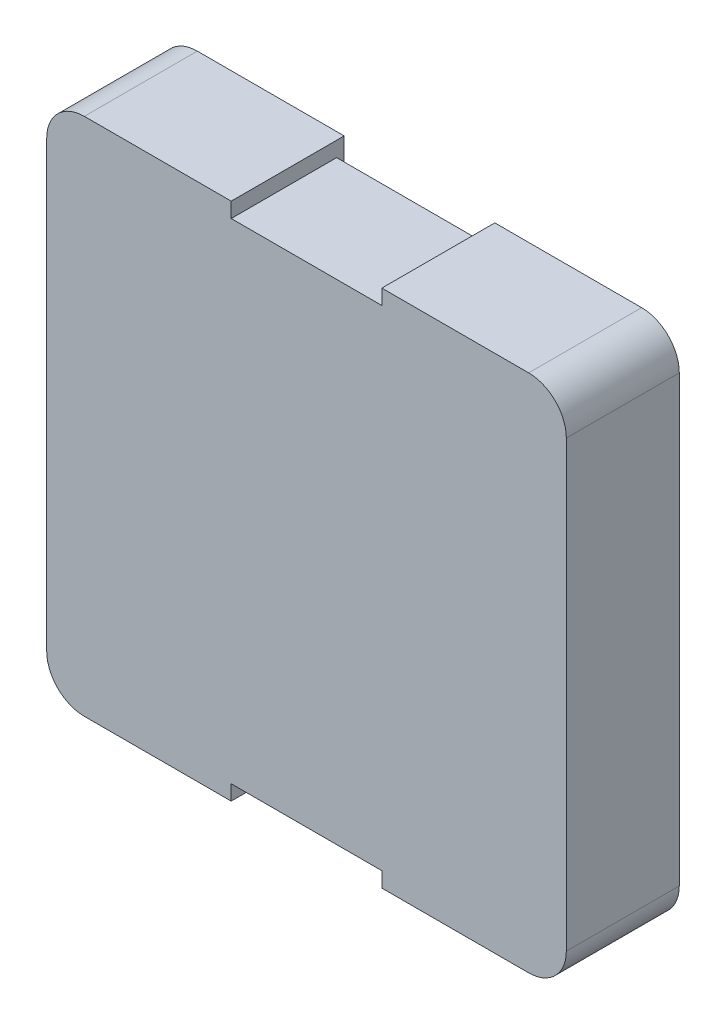
ISO-10303-21;
HEADER;
FILE_DESCRIPTION(('STEP AP214'),'2;1');
FILE_NAME('part.step','',(''),(''),'','','');
FILE_SCHEMA(('AUTOMOTIVE_DESIGN { 1 0 10303 214 1 1 1 1 }'));
ENDSEC;
DATA;
#1=APPLICATION_CONTEXT('core data for automotive mechanical design processes');
#2=APPLICATION_PROTOCOL_DEFINITION('international standard','automotive_design',2000,#1);
#3=PRODUCT_CONTEXT('',#1,'mechanical');
#4=PRODUCT('Part','Part','',(#3));
#5=PRODUCT_RELATED_PRODUCT_CATEGORY('part','',(#4));
#6=PRODUCT_DEFINITION_FORMATION('','',#4);
#7=PRODUCT_DEFINITION_CONTEXT('part definition',#1,'design');
#8=PRODUCT_DEFINITION('design','',#6,#7);
#9=PRODUCT_DEFINITION_SHAPE('','',#8);
#10=(LENGTH_UNIT() NAMED_UNIT(*) SI_UNIT(.MILLI.,.METRE.));
#11=(NAMED_UNIT(*) PLANE_ANGLE_UNIT() SI_UNIT($,.RADIAN.));
#12=(NAMED_UNIT(*) SI_UNIT($,.STERADIAN.) SOLID_ANGLE_UNIT());
#13=UNCERTAINTY_MEASURE_WITH_UNIT(LENGTH_MEASURE(1.E-05),#10,'distance_accuracy_value','');
#14=(GEOMETRIC_REPRESENTATION_CONTEXT(3) GLOBAL_UNCERTAINTY_ASSIGNED_CONTEXT((#13)) GLOBAL_UNIT_ASSIGNED_CONTEXT((#10,
#11,#12)) REPRESENTATION_CONTEXT('',''));
#15=CARTESIAN_POINT('',(0.,0.,0.));
#16=DIRECTION('',(0.,0.,1.));
#17=DIRECTION('',(1.,0.,0.));
#18=AXIS2_PLACEMENT_3D('',#15,#16,#17);
#19=CARTESIAN_POINT('',(-1.,1.5,1.5));
#20=DIRECTION('',(1.,0.,0.));
#21=DIRECTION('',(0.,0.,-1.));
#22=AXIS2_PLACEMENT_3D('',#19,#20,#21);
#23=PLANE('',#22);
#24=DIRECTION('',(0.,0.,-1.));
#25=VECTOR('',#24,1.);
#26=CARTESIAN_POINT('',(-1.,3.25,1.5));
#27=LINE('',#26,#25);
#28=CARTESIAN_POINT('',(-1.,3.25,1.5));
#29=VERTEX_POINT('',#28);
#30=CARTESIAN_POINT('',(-1.,3.25,0.1));
#31=VERTEX_POINT('',#30);
#32=EDGE_CURVE('E171',#29,#31,#27,.T.);
#33=ORIENTED_EDGE('',*,*,#32,.T.);
#34=DIRECTION('',(0.,1.,0.));
#35=VECTOR('',#34,1.);
#36=CARTESIAN_POINT('',(-1.,1.5,0.1));
#37=LINE('',#36,#35);
#38=CARTESIAN_POINT('',(-1.,1.5,0.1));
#39=VERTEX_POINT('',#38);
#40=EDGE_CURVE('E173',#39,#31,#37,.T.);
#41=ORIENTED_EDGE('',*,*,#40,.F.);
#42=DIRECTION('',(0.,0.,1.));
#43=VECTOR('',#42,1.);
#44=CARTESIAN_POINT('',(-1.,1.5,0.));
#45=LINE('',#44,#43);
#46=CARTESIAN_POINT('',(-1.,1.5,0.));
#47=VERTEX_POINT('',#46);
#48=EDGE_CURVE('E180',#47,#39,#45,.T.);
#49=ORIENTED_EDGE('',*,*,#48,.F.);
#50=DIRECTION('',(0.,1.,0.));
#51=VECTOR('',#50,1.);
#52=CARTESIAN_POINT('',(-1.,-3.45,0.));
#53=LINE('',#52,#51);
#54=CARTESIAN_POINT('',(-1.,3.45,0.));
#55=VERTEX_POINT('',#54);
#56=EDGE_CURVE('E228',#55,#47,#53,.F.);
#57=ORIENTED_EDGE('',*,*,#56,.F.);
#58=DIRECTION('',(0.,0.,-1.));
#59=VECTOR('',#58,1.);
#60=CARTESIAN_POINT('',(-1.,3.45,1.5));
#61=LINE('',#60,#59);
#62=CARTESIAN_POINT('',(-1.,3.45,1.5));
#63=VERTEX_POINT('',#62);
#64=EDGE_CURVE('E100',#55,#63,#61,.F.);
#65=ORIENTED_EDGE('',*,*,#64,.T.);
#66=DIRECTION('',(0.,1.,0.));
#67=VECTOR('',#66,1.);
#68=CARTESIAN_POINT('',(-1.,1.5,1.5));
#69=LINE('',#68,#67);
#70=EDGE_CURVE('E175',#63,#29,#69,.F.);
#71=ORIENTED_EDGE('',*,*,#70,.T.);
#72=EDGE_LOOP('',(#33,#41,#49,#57,#65,#71));
#73=FACE_BOUND('',#72,.T.);
#74=ADVANCED_FACE('F17',(#73),#23,.T.);
#75=CARTESIAN_POINT('',(1.,1.5,0.));
#76=DIRECTION('',(0.,1.,0.));
#77=DIRECTION('',(0.,0.,1.));
#78=AXIS2_PLACEMENT_3D('',#75,#76,#77);
#79=PLANE('',#78);
#80=DIRECTION('',(-1.,0.,0.));
#81=VECTOR('',#80,1.);
#82=CARTESIAN_POINT('',(3.45,1.5,0.));
#83=LINE('',#82,#81);
#84=CARTESIAN_POINT('',(1.,1.5,0.));
#85=VERTEX_POINT('',#84);
#86=EDGE_CURVE('E347',#47,#85,#83,.F.);
#87=ORIENTED_EDGE('',*,*,#86,.F.);
#88=ORIENTED_EDGE('',*,*,#48,.T.);
#89=DIRECTION('',(-1.,0.,0.));
#90=VECTOR('',#89,1.);
#91=CARTESIAN_POINT('',(1.,1.5,0.1));
#92=LINE('',#91,#90);
#93=CARTESIAN_POINT('',(1.,1.5,0.1));
#94=VERTEX_POINT('',#93);
#95=EDGE_CURVE('E187',#94,#39,#92,.T.);
#96=ORIENTED_EDGE('',*,*,#95,.F.);
#97=DIRECTION('',(0.,0.,1.));
#98=VECTOR('',#97,1.);
#99=CARTESIAN_POINT('',(1.,1.5,0.));
#100=LINE('',#99,#98);
#101=EDGE_CURVE('E338',#85,#94,#100,.T.);
#102=ORIENTED_EDGE('',*,*,#101,.F.);
#103=EDGE_LOOP('',(#87,#88,#96,#102));
#104=FACE_BOUND('',#103,.T.);
#105=ADVANCED_FACE('F451',(#104),#79,.T.);
#106=CARTESIAN_POINT('',(1.,3.45,0.));
#107=DIRECTION('',(-1.,0.,0.));
#108=DIRECTION('',(0.,0.,1.));
#109=AXIS2_PLACEMENT_3D('',#106,#107,#108);
#110=PLANE('',#109);
#111=ORIENTED_EDGE('',*,*,#101,.T.);
#112=DIRECTION('',(0.,1.,0.));
#113=VECTOR('',#112,1.);
#114=CARTESIAN_POINT('',(1.,1.5,0.1));
#115=LINE('',#114,#113);
#116=CARTESIAN_POINT('',(1.,3.25,0.1));
#117=VERTEX_POINT('',#116);
#118=EDGE_CURVE('E188',#117,#94,#115,.F.);
#119=ORIENTED_EDGE('',*,*,#118,.F.);
#120=DIRECTION('',(0.,0.,1.));
#121=VECTOR('',#120,1.);
#122=CARTESIAN_POINT('',(1.,3.25,0.));
#123=LINE('',#122,#121);
#124=CARTESIAN_POINT('',(1.,3.25,1.5));
#125=VERTEX_POINT('',#124);
#126=EDGE_CURVE('E192',#117,#125,#123,.T.);
#127=ORIENTED_EDGE('',*,*,#126,.T.);
#128=DIRECTION('',(0.,1.,0.));
#129=VECTOR('',#128,1.);
#130=CARTESIAN_POINT('',(1.,3.45,1.5));
#131=LINE('',#130,#129);
#132=CARTESIAN_POINT('',(1.,3.45,1.5));
#133=VERTEX_POINT('',#132);
#134=EDGE_CURVE('E281',#125,#133,#131,.T.);
#135=ORIENTED_EDGE('',*,*,#134,.T.);
#136=DIRECTION('',(0.,0.,1.));
#137=VECTOR('',#136,1.);
#138=CARTESIAN_POINT('',(1.,3.45,0.));
#139=LINE('',#138,#137);
#140=CARTESIAN_POINT('',(1.,3.45,0.));
#141=VERTEX_POINT('',#140);
#142=EDGE_CURVE('E284',#133,#141,#139,.F.);
#143=ORIENTED_EDGE('',*,*,#142,.T.);
#144=DIRECTION('',(0.,1.,0.));
#145=VECTOR('',#144,1.);
#146=CARTESIAN_POINT('',(1.,-3.45,0.));
#147=LINE('',#146,#145);
#148=EDGE_CURVE('E226',#85,#141,#147,.T.);
#149=ORIENTED_EDGE('',*,*,#148,.F.);
#150=EDGE_LOOP('',(#111,#119,#127,#135,#143,#149));
#151=FACE_BOUND('',#150,.T.);
#152=ADVANCED_FACE('F449',(#151),#110,.T.);
#153=CARTESIAN_POINT('',(1.,-1.5,0.));
#154=DIRECTION('',(-1.,0.,0.));
#155=DIRECTION('',(0.,0.,1.));
#156=AXIS2_PLACEMENT_3D('',#153,#154,#155);
#157=PLANE('',#156);
#158=DIRECTION('',(0.,1.,0.));
#159=VECTOR('',#158,1.);
#160=CARTESIAN_POINT('',(1.,-1.5,1.5));
#161=LINE('',#160,#159);
#162=CARTESIAN_POINT('',(1.,-3.45,1.5));
#163=VERTEX_POINT('',#162);
#164=CARTESIAN_POINT('',(1.,-3.25,1.5));
#165=VERTEX_POINT('',#164);
#166=EDGE_CURVE('E265',#163,#165,#161,.T.);
#167=ORIENTED_EDGE('',*,*,#166,.T.);
#168=DIRECTION('',(0.,0.,1.));
#169=VECTOR('',#168,1.);
#170=CARTESIAN_POINT('',(1.,-3.25,0.));
#171=LINE('',#170,#169);
#172=CARTESIAN_POINT('',(1.,-3.25,0.1));
#173=VERTEX_POINT('',#172);
#174=EDGE_CURVE('E268',#165,#173,#171,.F.);
#175=ORIENTED_EDGE('',*,*,#174,.T.);
#176=DIRECTION('',(0.,1.,0.));
#177=VECTOR('',#176,1.);
#178=CARTESIAN_POINT('',(1.,-3.25,0.1));
#179=LINE('',#178,#177);
#180=CARTESIAN_POINT('',(1.,-1.5,0.1));
#181=VERTEX_POINT('',#180);
#182=EDGE_CURVE('E237',#181,#173,#179,.F.);
#183=ORIENTED_EDGE('',*,*,#182,.F.);
#184=DIRECTION('',(0.,0.,-1.));
#185=VECTOR('',#184,1.);
#186=CARTESIAN_POINT('',(1.,-1.5,0.));
#187=LINE('',#186,#185);
#188=CARTESIAN_POINT('',(1.,-1.5,0.));
#189=VERTEX_POINT('',#188);
#190=EDGE_CURVE('E273',#189,#181,#187,.F.);
#191=ORIENTED_EDGE('',*,*,#190,.F.);
#192=DIRECTION('',(0.,1.,0.));
#193=VECTOR('',#192,1.);
#194=CARTESIAN_POINT('',(1.,-3.45,0.));
#195=LINE('',#194,#193);
#196=CARTESIAN_POINT('',(1.,-3.45,0.));
#197=VERTEX_POINT('',#196);
#198=EDGE_CURVE('E223',#197,#189,#195,.T.);
#199=ORIENTED_EDGE('',*,*,#198,.F.);
#200=DIRECTION('',(0.,0.,1.));
#201=VECTOR('',#200,1.);
#202=CARTESIAN_POINT('',(1.,-3.45,0.));
#203=LINE('',#202,#201);
#204=EDGE_CURVE('E269',#197,#163,#203,.T.);
#205=ORIENTED_EDGE('',*,*,#204,.T.);
#206=EDGE_LOOP('',(#167,#175,#183,#191,#199,#205));
#207=FACE_BOUND('',#206,.T.);
#208=ADVANCED_FACE('F434',(#207),#157,.T.);
#209=CARTESIAN_POINT('',(-1.,-1.5,0.));
#210=DIRECTION('',(0.,-1.,0.));
#211=DIRECTION('',(0.,0.,-1.));
#212=AXIS2_PLACEMENT_3D('',#209,#210,#211);
#213=PLANE('',#212);
#214=DIRECTION('',(-1.,0.,0.));
#215=VECTOR('',#214,1.);
#216=CARTESIAN_POINT('',(3.45,-1.5,0.));
#217=LINE('',#216,#215);
#218=CARTESIAN_POINT('',(-1.,-1.5,0.));
#219=VERTEX_POINT('',#218);
#220=EDGE_CURVE('E329',#189,#219,#217,.T.);
#221=ORIENTED_EDGE('',*,*,#220,.F.);
#222=ORIENTED_EDGE('',*,*,#190,.T.);
#223=DIRECTION('',(-1.,0.,0.));
#224=VECTOR('',#223,1.);
#225=CARTESIAN_POINT('',(1.,-1.5,0.1));
#226=LINE('',#225,#224);
#227=CARTESIAN_POINT('',(-1.,-1.5,0.1));
#228=VERTEX_POINT('',#227);
#229=EDGE_CURVE('E244',#228,#181,#226,.F.);
#230=ORIENTED_EDGE('',*,*,#229,.F.);
#231=DIRECTION('',(0.,0.,-1.));
#232=VECTOR('',#231,1.);
#233=CARTESIAN_POINT('',(-1.,-1.5,0.));
#234=LINE('',#233,#232);
#235=EDGE_CURVE('E317',#219,#228,#234,.F.);
#236=ORIENTED_EDGE('',*,*,#235,.F.);
#237=EDGE_LOOP('',(#221,#222,#230,#236));
#238=FACE_BOUND('',#237,.T.);
#239=ADVANCED_FACE('F437',(#238),#213,.T.);
#240=CARTESIAN_POINT('',(-1.,-3.45,0.));
#241=DIRECTION('',(1.,0.,0.));
#242=DIRECTION('',(0.,0.,-1.));
#243=AXIS2_PLACEMENT_3D('',#240,#241,#242);
#244=PLANE('',#243);
#245=DIRECTION('',(0.,1.,0.));
#246=VECTOR('',#245,1.);
#247=CARTESIAN_POINT('',(-1.,-3.45,1.5));
#248=LINE('',#247,#246);
#249=CARTESIAN_POINT('',(-1.,-3.25,1.5));
#250=VERTEX_POINT('',#249);
#251=CARTESIAN_POINT('',(-1.,-3.45,1.5));
#252=VERTEX_POINT('',#251);
#253=EDGE_CURVE('E304',#250,#252,#248,.F.);
#254=ORIENTED_EDGE('',*,*,#253,.T.);
#255=DIRECTION('',(0.,0.,-1.));
#256=VECTOR('',#255,1.);
#257=CARTESIAN_POINT('',(-1.,-3.45,0.));
#258=LINE('',#257,#256);
#259=CARTESIAN_POINT('',(-1.,-3.45,0.));
#260=VERTEX_POINT('',#259);
#261=EDGE_CURVE('E260',#252,#260,#258,.T.);
#262=ORIENTED_EDGE('',*,*,#261,.T.);
#263=DIRECTION('',(0.,1.,0.));
#264=VECTOR('',#263,1.);
#265=CARTESIAN_POINT('',(-1.,-3.45,0.));
#266=LINE('',#265,#264);
#267=EDGE_CURVE('E220',#219,#260,#266,.F.);
#268=ORIENTED_EDGE('',*,*,#267,.F.);
#269=ORIENTED_EDGE('',*,*,#235,.T.);
#270=DIRECTION('',(0.,1.,0.));
#271=VECTOR('',#270,1.);
#272=CARTESIAN_POINT('',(-1.,-3.25,0.1));
#273=LINE('',#272,#271);
#274=CARTESIAN_POINT('',(-1.,-3.25,0.1));
#275=VERTEX_POINT('',#274);
#276=EDGE_CURVE('E235',#275,#228,#273,.T.);
#277=ORIENTED_EDGE('',*,*,#276,.F.);
#278=DIRECTION('',(0.,0.,-1.));
#279=VECTOR('',#278,1.);
#280=CARTESIAN_POINT('',(-1.,-3.25,0.));
#281=LINE('',#280,#279);
#282=EDGE_CURVE('E307',#275,#250,#281,.F.);
#283=ORIENTED_EDGE('',*,*,#282,.T.);
#284=EDGE_LOOP('',(#254,#262,#268,#269,#277,#283));
#285=FACE_BOUND('',#284,.T.);
#286=ADVANCED_FACE('F383',(#285),#244,.T.);
#287=CARTESIAN_POINT('',(1.,-3.25,0.1));
#288=DIRECTION('',(0.,0.,-1.));
#289=DIRECTION('',(-1.,0.,0.));
#290=AXIS2_PLACEMENT_3D('',#287,#288,#289);
#291=PLANE('',#290);
#292=DIRECTION('',(1.,0.,0.));
#293=VECTOR('',#292,1.);
#294=CARTESIAN_POINT('',(-1.,-3.25,0.1));
#295=LINE('',#294,#293);
#296=EDGE_CURVE('E252',#275,#173,#295,.T.);
#297=ORIENTED_EDGE('',*,*,#296,.F.);
#298=ORIENTED_EDGE('',*,*,#276,.T.);
#299=ORIENTED_EDGE('',*,*,#229,.T.);
#300=ORIENTED_EDGE('',*,*,#182,.T.);
#301=EDGE_LOOP('',(#297,#298,#299,#300));
#302=FACE_BOUND('',#301,.T.);
#303=ADVANCED_FACE('F435',(#302),#291,.T.);
#304=CARTESIAN_POINT('',(2.95,-2.95,1.65));
#305=DIRECTION('',(0.,0.,-1.));
#306=DIRECTION('',(-1.,0.,0.));
#307=AXIS2_PLACEMENT_3D('',#304,#305,#306);
#308=CYLINDRICAL_SURFACE('',#307,0.5);
#309=CARTESIAN_POINT('',(2.95,-2.95,0.));
#310=DIRECTION('',(0.,0.,-1.));
#311=DIRECTION('',(-1.,0.,0.));
#312=AXIS2_PLACEMENT_3D('',#309,#310,#311);
#313=CIRCLE('',#312,0.5);
#314=CARTESIAN_POINT('',(3.45,-2.95,0.));
#315=VERTEX_POINT('',#314);
#316=CARTESIAN_POINT('',(2.95,-3.45,0.));
#317=VERTEX_POINT('',#316);
#318=EDGE_CURVE('E221',#315,#317,#313,.T.);
#319=ORIENTED_EDGE('',*,*,#318,.F.);
#320=DIRECTION('',(0.,0.,-1.));
#321=VECTOR('',#320,1.);
#322=CARTESIAN_POINT('',(3.45,-2.95,1.5));
#323=LINE('',#322,#321);
#324=CARTESIAN_POINT('',(3.45,-2.95,1.5));
#325=VERTEX_POINT('',#324);
#326=EDGE_CURVE('E366',#325,#315,#323,.T.);
#327=ORIENTED_EDGE('',*,*,#326,.F.);
#328=CARTESIAN_POINT('',(2.95,-2.95,1.5));
#329=DIRECTION('',(0.,0.,-1.));
#330=DIRECTION('',(-1.,0.,0.));
#331=AXIS2_PLACEMENT_3D('',#328,#329,#330);
#332=CIRCLE('',#331,0.5);
#333=CARTESIAN_POINT('',(2.95,-3.45,1.5));
#334=VERTEX_POINT('',#333);
#335=EDGE_CURVE('E20',#325,#334,#332,.T.);
#336=ORIENTED_EDGE('',*,*,#335,.T.);
#337=DIRECTION('',(0.,0.,-1.));
#338=VECTOR('',#337,1.);
#339=CARTESIAN_POINT('',(2.95,-3.45,1.5));
#340=LINE('',#339,#338);
#341=EDGE_CURVE('E369',#317,#334,#340,.F.);
#342=ORIENTED_EDGE('',*,*,#341,.F.);
#343=EDGE_LOOP('',(#319,#327,#336,#342));
#344=FACE_BOUND('',#343,.T.);
#345=ADVANCED_FACE('F443',(#344),#308,.T.);
#346=CARTESIAN_POINT('',(2.95,2.95,1.65));
#347=DIRECTION('',(0.,0.,-1.));
#348=DIRECTION('',(-1.,0.,0.));
#349=AXIS2_PLACEMENT_3D('',#346,#347,#348);
#350=CYLINDRICAL_SURFACE('',#349,0.5);
#351=CARTESIAN_POINT('',(2.95,2.95,0.));
#352=DIRECTION('',(0.,0.,-1.));
#353=DIRECTION('',(-1.,0.,0.));
#354=AXIS2_PLACEMENT_3D('',#351,#352,#353);
#355=CIRCLE('',#354,0.5);
#356=CARTESIAN_POINT('',(2.95,3.45,0.));
#357=VERTEX_POINT('',#356);
#358=CARTESIAN_POINT('',(3.45,2.95,0.));
#359=VERTEX_POINT('',#358);
#360=EDGE_CURVE('E224',#357,#359,#355,.T.);
#361=ORIENTED_EDGE('',*,*,#360,.F.);
#362=DIRECTION('',(0.,0.,1.));
#363=VECTOR('',#362,1.);
#364=CARTESIAN_POINT('',(2.95,3.45,0.));
#365=LINE('',#364,#363);
#366=CARTESIAN_POINT('',(2.95,3.45,1.5));
#367=VERTEX_POINT('',#366);
#368=EDGE_CURVE('E200',#367,#357,#365,.F.);
#369=ORIENTED_EDGE('',*,*,#368,.F.);
#370=CARTESIAN_POINT('',(2.95,2.95,1.5));
#371=DIRECTION('',(0.,0.,-1.));
#372=DIRECTION('',(-1.,0.,0.));
#373=AXIS2_PLACEMENT_3D('',#370,#371,#372);
#374=CIRCLE('',#373,0.5);
#375=CARTESIAN_POINT('',(3.45,2.95,1.5));
#376=VERTEX_POINT('',#375);
#377=EDGE_CURVE('E229',#367,#376,#374,.T.);
#378=ORIENTED_EDGE('',*,*,#377,.T.);
#379=DIRECTION('',(0.,0.,-1.));
#380=VECTOR('',#379,1.);
#381=CARTESIAN_POINT('',(3.45,2.95,1.5));
#382=LINE('',#381,#380);
#383=EDGE_CURVE('E365',#359,#376,#382,.F.);
#384=ORIENTED_EDGE('',*,*,#383,.F.);
#385=EDGE_LOOP('',(#361,#369,#378,#384));
#386=FACE_BOUND('',#385,.T.);
#387=ADVANCED_FACE('F445',(#386),#350,.T.);
#388=CARTESIAN_POINT('',(1.,1.5,0.1));
#389=DIRECTION('',(0.,0.,-1.));
#390=DIRECTION('',(-1.,0.,0.));
#391=AXIS2_PLACEMENT_3D('',#388,#389,#390);
#392=PLANE('',#391);
#393=DIRECTION('',(1.,0.,0.));
#394=VECTOR('',#393,1.);
#395=CARTESIAN_POINT('',(-1.,3.25,0.1));
#396=LINE('',#395,#394);
#397=EDGE_CURVE('E186',#117,#31,#396,.F.);
#398=ORIENTED_EDGE('',*,*,#397,.F.);
#399=ORIENTED_EDGE('',*,*,#118,.T.);
#400=ORIENTED_EDGE('',*,*,#95,.T.);
#401=ORIENTED_EDGE('',*,*,#40,.T.);
#402=EDGE_LOOP('',(#398,#399,#400,#401));
#403=FACE_BOUND('',#402,.T.);
#404=ADVANCED_FACE('F184',(#403),#392,.T.);
#405=CARTESIAN_POINT('',(-2.95,2.95,1.65));
#406=DIRECTION('',(0.,0.,-1.));
#407=DIRECTION('',(-1.,0.,0.));
#408=AXIS2_PLACEMENT_3D('',#405,#406,#407);
#409=CYLINDRICAL_SURFACE('',#408,0.5);
#410=CARTESIAN_POINT('',(-2.95,2.95,0.));
#411=DIRECTION('',(0.,0.,-1.));
#412=DIRECTION('',(-1.,0.,0.));
#413=AXIS2_PLACEMENT_3D('',#410,#411,#412);
#414=CIRCLE('',#413,0.5);
#415=CARTESIAN_POINT('',(-3.45,2.95,0.));
#416=VERTEX_POINT('',#415);
#417=CARTESIAN_POINT('',(-2.95,3.45,0.));
#418=VERTEX_POINT('',#417);
#419=EDGE_CURVE('E87',#416,#418,#414,.T.);
#420=ORIENTED_EDGE('',*,*,#419,.F.);
#421=DIRECTION('',(0.,0.,1.));
#422=VECTOR('',#421,1.);
#423=CARTESIAN_POINT('',(-3.45,2.95,0.));
#424=LINE('',#423,#422);
#425=CARTESIAN_POINT('',(-3.45,2.95,1.5));
#426=VERTEX_POINT('',#425);
#427=EDGE_CURVE('E399',#426,#416,#424,.F.);
#428=ORIENTED_EDGE('',*,*,#427,.F.);
#429=CARTESIAN_POINT('',(-2.95,2.95,1.5));
#430=DIRECTION('',(0.,0.,-1.));
#431=DIRECTION('',(-1.,0.,0.));
#432=AXIS2_PLACEMENT_3D('',#429,#430,#431);
#433=CIRCLE('',#432,0.5);
#434=CARTESIAN_POINT('',(-2.95,3.45,1.5));
#435=VERTEX_POINT('',#434);
#436=EDGE_CURVE('E34',#426,#435,#433,.T.);
#437=ORIENTED_EDGE('',*,*,#436,.T.);
#438=DIRECTION('',(0.,0.,1.));
#439=VECTOR('',#438,1.);
#440=CARTESIAN_POINT('',(-2.95,3.45,0.));
#441=LINE('',#440,#439);
#442=EDGE_CURVE('E197',#418,#435,#441,.T.);
#443=ORIENTED_EDGE('',*,*,#442,.F.);
#444=EDGE_LOOP('',(#420,#428,#437,#443));
#445=FACE_BOUND('',#444,.T.);
#446=ADVANCED_FACE('F487',(#445),#409,.T.);
#447=CARTESIAN_POINT('',(3.45,-3.45,0.));
#448=DIRECTION('',(0.,0.,-1.));
#449=DIRECTION('',(-1.,0.,0.));
#450=AXIS2_PLACEMENT_3D('',#447,#448,#449);
#451=PLANE('',#450);
#452=CARTESIAN_POINT('',(-2.95,-2.95,0.));
#453=DIRECTION('',(0.,0.,-1.));
#454=DIRECTION('',(-1.,0.,0.));
#455=AXIS2_PLACEMENT_3D('',#452,#453,#454);
#456=CIRCLE('',#455,0.5);
#457=CARTESIAN_POINT('',(-3.45,-2.95,0.));
#458=VERTEX_POINT('',#457);
#459=CARTESIAN_POINT('',(-2.95,-3.45,0.));
#460=VERTEX_POINT('',#459);
#461=EDGE_CURVE('E215',#458,#460,#456,.F.);
#462=ORIENTED_EDGE('',*,*,#461,.F.);
#463=DIRECTION('',(0.,1.,0.));
#464=VECTOR('',#463,1.);
#465=CARTESIAN_POINT('',(-3.45,-2.95,0.));
#466=LINE('',#465,#464);
#467=EDGE_CURVE('E396',#416,#458,#466,.F.);
#468=ORIENTED_EDGE('',*,*,#467,.F.);
#469=ORIENTED_EDGE('',*,*,#419,.T.);
#470=DIRECTION('',(1.,0.,0.));
#471=VECTOR('',#470,1.);
#472=CARTESIAN_POINT('',(-1.,3.45,0.));
#473=LINE('',#472,#471);
#474=EDGE_CURVE('E194',#55,#418,#473,.F.);
#475=ORIENTED_EDGE('',*,*,#474,.F.);
#476=ORIENTED_EDGE('',*,*,#56,.T.);
#477=ORIENTED_EDGE('',*,*,#86,.T.);
#478=ORIENTED_EDGE('',*,*,#148,.T.);
#479=DIRECTION('',(1.,0.,0.));
#480=VECTOR('',#479,1.);
#481=CARTESIAN_POINT('',(2.95,3.45,0.));
#482=LINE('',#481,#480);
#483=EDGE_CURVE('E195',#357,#141,#482,.F.);
#484=ORIENTED_EDGE('',*,*,#483,.F.);
#485=ORIENTED_EDGE('',*,*,#360,.T.);
#486=DIRECTION('',(0.,1.,0.));
#487=VECTOR('',#486,1.);
#488=CARTESIAN_POINT('',(3.45,-2.95,0.));
#489=LINE('',#488,#487);
#490=EDGE_CURVE('E362',#315,#359,#489,.T.);
#491=ORIENTED_EDGE('',*,*,#490,.F.);
#492=ORIENTED_EDGE('',*,*,#318,.T.);
#493=DIRECTION('',(1.,0.,0.));
#494=VECTOR('',#493,1.);
#495=CARTESIAN_POINT('',(1.,-3.45,0.));
#496=LINE('',#495,#494);
#497=EDGE_CURVE('E255',#197,#317,#496,.T.);
#498=ORIENTED_EDGE('',*,*,#497,.F.);
#499=ORIENTED_EDGE('',*,*,#198,.T.);
#500=ORIENTED_EDGE('',*,*,#220,.T.);
#501=ORIENTED_EDGE('',*,*,#267,.T.);
#502=DIRECTION('',(1.,0.,0.));
#503=VECTOR('',#502,1.);
#504=CARTESIAN_POINT('',(-2.95,-3.45,0.));
#505=LINE('',#504,#503);
#506=EDGE_CURVE('E256',#460,#260,#505,.T.);
#507=ORIENTED_EDGE('',*,*,#506,.F.);
#508=EDGE_LOOP('',(#462,#468,#469,#475,#476,#477,#478,#484,#485,#491,#492,#498,#499,#500,#501,#507));
#509=FACE_BOUND('',#508,.T.);
#510=ADVANCED_FACE('F387',(#509),#451,.T.);
#511=CARTESIAN_POINT('',(-2.95,-2.95,1.65));
#512=DIRECTION('',(0.,0.,-1.));
#513=DIRECTION('',(-1.,0.,0.));
#514=AXIS2_PLACEMENT_3D('',#511,#512,#513);
#515=CYLINDRICAL_SURFACE('',#514,0.5);
#516=ORIENTED_EDGE('',*,*,#461,.T.);
#517=DIRECTION('',(0.,0.,-1.));
#518=VECTOR('',#517,1.);
#519=CARTESIAN_POINT('',(-2.95,-3.45,1.5));
#520=LINE('',#519,#518);
#521=CARTESIAN_POINT('',(-2.95,-3.45,1.5));
#522=VERTEX_POINT('',#521);
#523=EDGE_CURVE('E218',#522,#460,#520,.T.);
#524=ORIENTED_EDGE('',*,*,#523,.F.);
#525=CARTESIAN_POINT('',(-2.95,-2.95,1.5));
#526=DIRECTION('',(0.,0.,-1.));
#527=DIRECTION('',(-1.,0.,0.));
#528=AXIS2_PLACEMENT_3D('',#525,#526,#527);
#529=CIRCLE('',#528,0.5);
#530=CARTESIAN_POINT('',(-3.45,-2.95,1.5));
#531=VERTEX_POINT('',#530);
#532=EDGE_CURVE('E61',#522,#531,#529,.T.);
#533=ORIENTED_EDGE('',*,*,#532,.T.);
#534=DIRECTION('',(0.,0.,1.));
#535=VECTOR('',#534,1.);
#536=CARTESIAN_POINT('',(-3.45,-2.95,0.));
#537=LINE('',#536,#535);
#538=EDGE_CURVE('E398',#458,#531,#537,.T.);
#539=ORIENTED_EDGE('',*,*,#538,.F.);
#540=EDGE_LOOP('',(#516,#524,#533,#539));
#541=FACE_BOUND('',#540,.T.);
#542=ADVANCED_FACE('F482',(#541),#515,.T.);
#543=CARTESIAN_POINT('',(-2.95,-3.45,1.5));
#544=DIRECTION('',(0.,-1.,0.));
#545=DIRECTION('',(0.,0.,-1.));
#546=AXIS2_PLACEMENT_3D('',#543,#544,#545);
#547=PLANE('',#546);
#548=ORIENTED_EDGE('',*,*,#261,.F.);
#549=DIRECTION('',(1.,0.,0.));
#550=VECTOR('',#549,1.);
#551=CARTESIAN_POINT('',(-3.45,-3.45,1.5));
#552=LINE('',#551,#550);
#553=EDGE_CURVE('E314',#522,#252,#552,.T.);
#554=ORIENTED_EDGE('',*,*,#553,.F.);
#555=ORIENTED_EDGE('',*,*,#523,.T.);
#556=ORIENTED_EDGE('',*,*,#506,.T.);
#557=EDGE_LOOP('',(#548,#554,#555,#556));
#558=FACE_BOUND('',#557,.T.);
#559=ADVANCED_FACE('F390',(#558),#547,.T.);
#560=CARTESIAN_POINT('',(-1.,-3.25,1.5));
#561=DIRECTION('',(0.,-1.,0.));
#562=DIRECTION('',(0.,0.,-1.));
#563=AXIS2_PLACEMENT_3D('',#560,#561,#562);
#564=PLANE('',#563);
#565=DIRECTION('',(1.,0.,0.));
#566=VECTOR('',#565,1.);
#567=CARTESIAN_POINT('',(-3.45,-3.25,1.5));
#568=LINE('',#567,#566);
#569=EDGE_CURVE('E310',#250,#165,#568,.T.);
#570=ORIENTED_EDGE('',*,*,#569,.F.);
#571=ORIENTED_EDGE('',*,*,#282,.F.);
#572=ORIENTED_EDGE('',*,*,#296,.T.);
#573=ORIENTED_EDGE('',*,*,#174,.F.);
#574=EDGE_LOOP('',(#570,#571,#572,#573));
#575=FACE_BOUND('',#574,.T.);
#576=ADVANCED_FACE('F431',(#575),#564,.T.);
#577=CARTESIAN_POINT('',(1.,-3.45,1.5));
#578=DIRECTION('',(0.,-1.,0.));
#579=DIRECTION('',(0.,0.,-1.));
#580=AXIS2_PLACEMENT_3D('',#577,#578,#579);
#581=PLANE('',#580);
#582=DIRECTION('',(1.,0.,0.));
#583=VECTOR('',#582,1.);
#584=CARTESIAN_POINT('',(-3.45,-3.45,1.5));
#585=LINE('',#584,#583);
#586=EDGE_CURVE('E313',#163,#334,#585,.T.);
#587=ORIENTED_EDGE('',*,*,#586,.F.);
#588=ORIENTED_EDGE('',*,*,#204,.F.);
#589=ORIENTED_EDGE('',*,*,#497,.T.);
#590=ORIENTED_EDGE('',*,*,#341,.T.);
#591=EDGE_LOOP('',(#587,#588,#589,#590));
#592=FACE_BOUND('',#591,.T.);
#593=ADVANCED_FACE('F442',(#592),#581,.T.);
#594=CARTESIAN_POINT('',(3.45,-2.95,1.5));
#595=DIRECTION('',(1.,0.,0.));
#596=DIRECTION('',(0.,0.,-1.));
#597=AXIS2_PLACEMENT_3D('',#594,#595,#596);
#598=PLANE('',#597);
#599=ORIENTED_EDGE('',*,*,#490,.T.);
#600=ORIENTED_EDGE('',*,*,#383,.T.);
#601=DIRECTION('',(0.,1.,0.));
#602=VECTOR('',#601,1.);
#603=CARTESIAN_POINT('',(3.45,-3.45,1.5));
#604=LINE('',#603,#602);
#605=EDGE_CURVE('E418',#325,#376,#604,.T.);
#606=ORIENTED_EDGE('',*,*,#605,.F.);
#607=ORIENTED_EDGE('',*,*,#326,.T.);
#608=EDGE_LOOP('',(#599,#600,#606,#607));
#609=FACE_BOUND('',#608,.T.);
#610=ADVANCED_FACE('F417',(#609),#598,.T.);
#611=CARTESIAN_POINT('',(2.95,3.45,0.));
#612=DIRECTION('',(0.,1.,0.));
#613=DIRECTION('',(0.,0.,1.));
#614=AXIS2_PLACEMENT_3D('',#611,#612,#613);
#615=PLANE('',#614);
#616=ORIENTED_EDGE('',*,*,#142,.F.);
#617=DIRECTION('',(1.,0.,0.));
#618=VECTOR('',#617,1.);
#619=CARTESIAN_POINT('',(-3.45,3.45,1.5));
#620=LINE('',#619,#618);
#621=EDGE_CURVE('E289',#367,#133,#620,.F.);
#622=ORIENTED_EDGE('',*,*,#621,.F.);
#623=ORIENTED_EDGE('',*,*,#368,.T.);
#624=ORIENTED_EDGE('',*,*,#483,.T.);
#625=EDGE_LOOP('',(#616,#622,#623,#624));
#626=FACE_BOUND('',#625,.T.);
#627=ADVANCED_FACE('F448',(#626),#615,.T.);
#628=CARTESIAN_POINT('',(-1.,3.25,0.1));
#629=DIRECTION('',(0.,1.,0.));
#630=DIRECTION('',(0.,0.,1.));
#631=AXIS2_PLACEMENT_3D('',#628,#629,#630);
#632=PLANE('',#631);
#633=ORIENTED_EDGE('',*,*,#126,.F.);
#634=ORIENTED_EDGE('',*,*,#397,.T.);
#635=ORIENTED_EDGE('',*,*,#32,.F.);
#636=DIRECTION('',(1.,0.,0.));
#637=VECTOR('',#636,1.);
#638=CARTESIAN_POINT('',(-3.45,3.25,1.5));
#639=LINE('',#638,#637);
#640=EDGE_CURVE('E287',#125,#29,#639,.F.);
#641=ORIENTED_EDGE('',*,*,#640,.F.);
#642=EDGE_LOOP('',(#633,#634,#635,#641));
#643=FACE_BOUND('',#642,.T.);
#644=ADVANCED_FACE('F190',(#643),#632,.T.);
#645=CARTESIAN_POINT('',(-1.,3.45,0.));
#646=DIRECTION('',(0.,1.,0.));
#647=DIRECTION('',(0.,0.,1.));
#648=AXIS2_PLACEMENT_3D('',#645,#646,#647);
#649=PLANE('',#648);
#650=DIRECTION('',(1.,0.,0.));
#651=VECTOR('',#650,1.);
#652=CARTESIAN_POINT('',(-3.45,3.45,1.5));
#653=LINE('',#652,#651);
#654=EDGE_CURVE('E26',#63,#435,#653,.F.);
#655=ORIENTED_EDGE('',*,*,#654,.F.);
#656=ORIENTED_EDGE('',*,*,#64,.F.);
#657=ORIENTED_EDGE('',*,*,#474,.T.);
#658=ORIENTED_EDGE('',*,*,#442,.T.);
#659=EDGE_LOOP('',(#655,#656,#657,#658));
#660=FACE_BOUND('',#659,.T.);
#661=ADVANCED_FACE('F465',(#660),#649,.T.);
#662=CARTESIAN_POINT('',(-3.45,-2.95,0.));
#663=DIRECTION('',(-1.,0.,0.));
#664=DIRECTION('',(0.,0.,1.));
#665=AXIS2_PLACEMENT_3D('',#662,#663,#664);
#666=PLANE('',#665);
#667=ORIENTED_EDGE('',*,*,#467,.T.);
#668=ORIENTED_EDGE('',*,*,#538,.T.);
#669=DIRECTION('',(0.,1.,0.));
#670=VECTOR('',#669,1.);
#671=CARTESIAN_POINT('',(-3.45,-3.45,1.5));
#672=LINE('',#671,#670);
#673=EDGE_CURVE('E11',#426,#531,#672,.F.);
#674=ORIENTED_EDGE('',*,*,#673,.F.);
#675=ORIENTED_EDGE('',*,*,#427,.T.);
#676=EDGE_LOOP('',(#667,#668,#674,#675));
#677=FACE_BOUND('',#676,.T.);
#678=ADVANCED_FACE('F460',(#677),#666,.T.);
#679=CARTESIAN_POINT('',(-3.45,-3.45,1.5));
#680=DIRECTION('',(0.,0.,1.));
#681=DIRECTION('',(1.,0.,0.));
#682=AXIS2_PLACEMENT_3D('',#679,#680,#681);
#683=PLANE('',#682);
#684=ORIENTED_EDGE('',*,*,#436,.F.);
#685=ORIENTED_EDGE('',*,*,#673,.T.);
#686=ORIENTED_EDGE('',*,*,#532,.F.);
#687=ORIENTED_EDGE('',*,*,#553,.T.);
#688=ORIENTED_EDGE('',*,*,#253,.F.);
#689=ORIENTED_EDGE('',*,*,#569,.T.);
#690=ORIENTED_EDGE('',*,*,#166,.F.);
#691=ORIENTED_EDGE('',*,*,#586,.T.);
#692=ORIENTED_EDGE('',*,*,#335,.F.);
#693=ORIENTED_EDGE('',*,*,#605,.T.);
#694=ORIENTED_EDGE('',*,*,#377,.F.);
#695=ORIENTED_EDGE('',*,*,#621,.T.);
#696=ORIENTED_EDGE('',*,*,#134,.F.);
#697=ORIENTED_EDGE('',*,*,#640,.T.);
#698=ORIENTED_EDGE('',*,*,#70,.F.);
#699=ORIENTED_EDGE('',*,*,#654,.T.);
#700=EDGE_LOOP('',(#684,#685,#686,#687,#688,#689,#690,#691,#692,#693,#694,#695,#696,#697,#698,#699));
#701=FACE_BOUND('',#700,.T.);
#702=ADVANCED_FACE('F420',(#701),#683,.T.);
#703=CLOSED_SHELL('',(#74,#105,#152,#208,#239,#286,#303,#345,#387,#404,#446,#510,#542,#559,#576,
#593,#610,#627,#644,#661,#678,#702));
#704=MANIFOLD_SOLID_BREP('B1',#703);
#705=ADVANCED_BREP_SHAPE_REPRESENTATION('',(#18,#704),#14);
#706=SHAPE_DEFINITION_REPRESENTATION(#9,#705);
ENDSEC;
END-ISO-10303-21;
